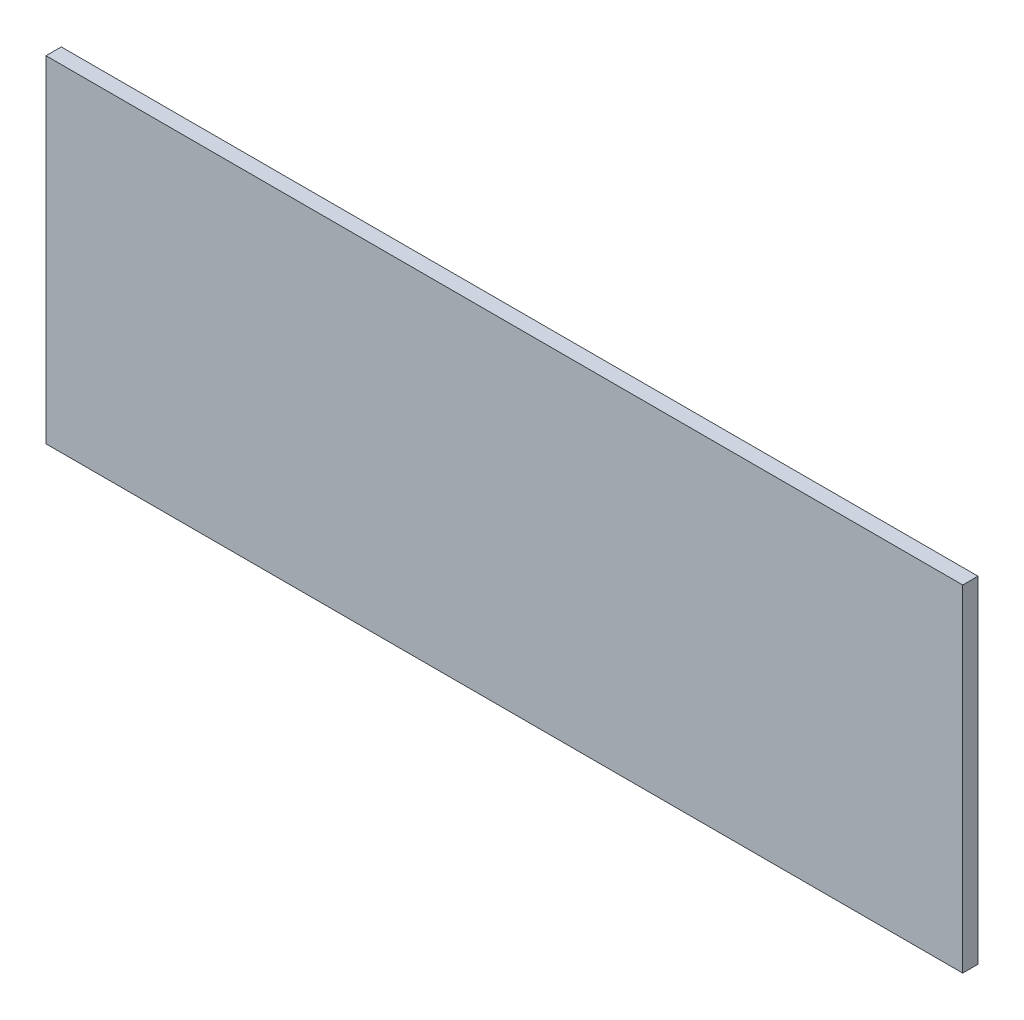
ISO-10303-21;
HEADER;
FILE_DESCRIPTION(('STEP AP214'),'2;1');
FILE_NAME('part.step','',(''),(''),'','','');
FILE_SCHEMA(('AUTOMOTIVE_DESIGN { 1 0 10303 214 1 1 1 1 }'));
ENDSEC;
DATA;
#1=APPLICATION_CONTEXT('core data for automotive mechanical design processes');
#2=APPLICATION_PROTOCOL_DEFINITION('international standard','automotive_design',2000,#1);
#3=PRODUCT_CONTEXT('',#1,'mechanical');
#4=PRODUCT('Part','Part','',(#3));
#5=PRODUCT_RELATED_PRODUCT_CATEGORY('part','',(#4));
#6=PRODUCT_DEFINITION_FORMATION('','',#4);
#7=PRODUCT_DEFINITION_CONTEXT('part definition',#1,'design');
#8=PRODUCT_DEFINITION('design','',#6,#7);
#9=PRODUCT_DEFINITION_SHAPE('','',#8);
#10=(LENGTH_UNIT() NAMED_UNIT(*) SI_UNIT(.MILLI.,.METRE.));
#11=(NAMED_UNIT(*) PLANE_ANGLE_UNIT() SI_UNIT($,.RADIAN.));
#12=(NAMED_UNIT(*) SI_UNIT($,.STERADIAN.) SOLID_ANGLE_UNIT());
#13=UNCERTAINTY_MEASURE_WITH_UNIT(LENGTH_MEASURE(1.E-05),#10,'distance_accuracy_value','');
#14=(GEOMETRIC_REPRESENTATION_CONTEXT(3) GLOBAL_UNCERTAINTY_ASSIGNED_CONTEXT((#13)) GLOBAL_UNIT_ASSIGNED_CONTEXT((#10,
#11,#12)) REPRESENTATION_CONTEXT('',''));
#15=CARTESIAN_POINT('',(0.,0.,0.));
#16=DIRECTION('',(0.,0.,1.));
#17=DIRECTION('',(1.,0.,0.));
#18=AXIS2_PLACEMENT_3D('',#15,#16,#17);
#19=CARTESIAN_POINT('',(90.,-33.,3.));
#20=DIRECTION('',(-1.,0.,0.));
#21=DIRECTION('',(0.,0.,1.));
#22=AXIS2_PLACEMENT_3D('',#19,#20,#21);
#23=PLANE('',#22);
#24=DIRECTION('',(0.,1.,0.));
#25=VECTOR('',#24,1.);
#26=CARTESIAN_POINT('',(90.,-33.,0.));
#27=LINE('',#26,#25);
#28=CARTESIAN_POINT('',(90.,-33.,0.));
#29=VERTEX_POINT('',#28);
#30=CARTESIAN_POINT('',(90.,33.,0.));
#31=VERTEX_POINT('',#30);
#32=EDGE_CURVE('E96',#29,#31,#27,.T.);
#33=ORIENTED_EDGE('',*,*,#32,.T.);
#34=DIRECTION('',(0.,0.,-1.));
#35=VECTOR('',#34,1.);
#36=CARTESIAN_POINT('',(90.,33.,3.));
#37=LINE('',#36,#35);
#38=CARTESIAN_POINT('',(90.,33.,3.));
#39=VERTEX_POINT('',#38);
#40=EDGE_CURVE('E11',#39,#31,#37,.T.);
#41=ORIENTED_EDGE('',*,*,#40,.F.);
#42=DIRECTION('',(0.,1.,0.));
#43=VECTOR('',#42,1.);
#44=CARTESIAN_POINT('',(90.,-33.,3.));
#45=LINE('',#44,#43);
#46=CARTESIAN_POINT('',(90.,-33.,3.));
#47=VERTEX_POINT('',#46);
#48=EDGE_CURVE('E84',#47,#39,#45,.T.);
#49=ORIENTED_EDGE('',*,*,#48,.F.);
#50=DIRECTION('',(0.,0.,-1.));
#51=VECTOR('',#50,1.);
#52=CARTESIAN_POINT('',(90.,-33.,3.));
#53=LINE('',#52,#51);
#54=EDGE_CURVE('E92',#47,#29,#53,.T.);
#55=ORIENTED_EDGE('',*,*,#54,.T.);
#56=EDGE_LOOP('',(#33,#41,#49,#55));
#57=FACE_BOUND('',#56,.T.);
#58=ADVANCED_FACE('F33',(#57),#23,.F.);
#59=CARTESIAN_POINT('',(-90.,33.,3.));
#60=DIRECTION('',(0.,-1.,0.));
#61=DIRECTION('',(0.,0.,-1.));
#62=AXIS2_PLACEMENT_3D('',#59,#60,#61);
#63=PLANE('',#62);
#64=DIRECTION('',(-1.,0.,0.));
#65=VECTOR('',#64,1.);
#66=CARTESIAN_POINT('',(-90.,33.,0.));
#67=LINE('',#66,#65);
#68=CARTESIAN_POINT('',(-90.,33.,0.));
#69=VERTEX_POINT('',#68);
#70=EDGE_CURVE('E88',#31,#69,#67,.T.);
#71=ORIENTED_EDGE('',*,*,#70,.T.);
#72=DIRECTION('',(0.,0.,-1.));
#73=VECTOR('',#72,1.);
#74=CARTESIAN_POINT('',(-90.,33.,3.));
#75=LINE('',#74,#73);
#76=CARTESIAN_POINT('',(-90.,33.,3.));
#77=VERTEX_POINT('',#76);
#78=EDGE_CURVE('E41',#77,#69,#75,.T.);
#79=ORIENTED_EDGE('',*,*,#78,.F.);
#80=DIRECTION('',(-1.,0.,0.));
#81=VECTOR('',#80,1.);
#82=CARTESIAN_POINT('',(-90.,33.,3.));
#83=LINE('',#82,#81);
#84=EDGE_CURVE('E79',#39,#77,#83,.T.);
#85=ORIENTED_EDGE('',*,*,#84,.F.);
#86=ORIENTED_EDGE('',*,*,#40,.T.);
#87=EDGE_LOOP('',(#71,#79,#85,#86));
#88=FACE_BOUND('',#87,.T.);
#89=ADVANCED_FACE('F87',(#88),#63,.F.);
#90=CARTESIAN_POINT('',(-90.,-33.,3.));
#91=DIRECTION('',(1.,0.,0.));
#92=DIRECTION('',(0.,0.,-1.));
#93=AXIS2_PLACEMENT_3D('',#90,#91,#92);
#94=PLANE('',#93);
#95=DIRECTION('',(0.,-1.,0.));
#96=VECTOR('',#95,1.);
#97=CARTESIAN_POINT('',(-90.,-33.,0.));
#98=LINE('',#97,#96);
#99=CARTESIAN_POINT('',(-90.,-33.,0.));
#100=VERTEX_POINT('',#99);
#101=EDGE_CURVE('E66',#69,#100,#98,.T.);
#102=ORIENTED_EDGE('',*,*,#101,.T.);
#103=DIRECTION('',(0.,0.,-1.));
#104=VECTOR('',#103,1.);
#105=CARTESIAN_POINT('',(-90.,-33.,3.));
#106=LINE('',#105,#104);
#107=CARTESIAN_POINT('',(-90.,-33.,3.));
#108=VERTEX_POINT('',#107);
#109=EDGE_CURVE('E89',#108,#100,#106,.T.);
#110=ORIENTED_EDGE('',*,*,#109,.F.);
#111=DIRECTION('',(0.,-1.,0.));
#112=VECTOR('',#111,1.);
#113=CARTESIAN_POINT('',(-90.,-33.,3.));
#114=LINE('',#113,#112);
#115=EDGE_CURVE('E82',#77,#108,#114,.T.);
#116=ORIENTED_EDGE('',*,*,#115,.F.);
#117=ORIENTED_EDGE('',*,*,#78,.T.);
#118=EDGE_LOOP('',(#102,#110,#116,#117));
#119=FACE_BOUND('',#118,.T.);
#120=ADVANCED_FACE('F90',(#119),#94,.F.);
#121=CARTESIAN_POINT('',(-90.,-33.,3.));
#122=DIRECTION('',(0.,1.,0.));
#123=DIRECTION('',(0.,0.,1.));
#124=AXIS2_PLACEMENT_3D('',#121,#122,#123);
#125=PLANE('',#124);
#126=DIRECTION('',(1.,0.,0.));
#127=VECTOR('',#126,1.);
#128=CARTESIAN_POINT('',(-90.,-33.,0.));
#129=LINE('',#128,#127);
#130=EDGE_CURVE('E72',#100,#29,#129,.T.);
#131=ORIENTED_EDGE('',*,*,#130,.T.);
#132=ORIENTED_EDGE('',*,*,#54,.F.);
#133=DIRECTION('',(1.,0.,0.));
#134=VECTOR('',#133,1.);
#135=CARTESIAN_POINT('',(-90.,-33.,3.));
#136=LINE('',#135,#134);
#137=EDGE_CURVE('E49',#108,#47,#136,.T.);
#138=ORIENTED_EDGE('',*,*,#137,.F.);
#139=ORIENTED_EDGE('',*,*,#109,.T.);
#140=EDGE_LOOP('',(#131,#132,#138,#139));
#141=FACE_BOUND('',#140,.T.);
#142=ADVANCED_FACE('F103',(#141),#125,.F.);
#143=CARTESIAN_POINT('',(0.,0.,3.));
#144=DIRECTION('',(0.,0.,-1.));
#145=DIRECTION('',(-1.,0.,0.));
#146=AXIS2_PLACEMENT_3D('',#143,#144,#145);
#147=PLANE('',#146);
#148=ORIENTED_EDGE('',*,*,#48,.T.);
#149=ORIENTED_EDGE('',*,*,#84,.T.);
#150=ORIENTED_EDGE('',*,*,#115,.T.);
#151=ORIENTED_EDGE('',*,*,#137,.T.);
#152=EDGE_LOOP('',(#148,#149,#150,#151));
#153=FACE_BOUND('',#152,.T.);
#154=ADVANCED_FACE('F80',(#153),#147,.F.);
#155=CARTESIAN_POINT('',(0.,0.,0.));
#156=DIRECTION('',(0.,0.,-1.));
#157=DIRECTION('',(-1.,0.,0.));
#158=AXIS2_PLACEMENT_3D('',#155,#156,#157);
#159=PLANE('',#158);
#160=ORIENTED_EDGE('',*,*,#32,.F.);
#161=ORIENTED_EDGE('',*,*,#130,.F.);
#162=ORIENTED_EDGE('',*,*,#101,.F.);
#163=ORIENTED_EDGE('',*,*,#70,.F.);
#164=EDGE_LOOP('',(#160,#161,#162,#163));
#165=FACE_BOUND('',#164,.T.);
#166=ADVANCED_FACE('F106',(#165),#159,.T.);
#167=CLOSED_SHELL('',(#58,#89,#120,#142,#154,#166));
#168=MANIFOLD_SOLID_BREP('B2',#167);
#169=ADVANCED_BREP_SHAPE_REPRESENTATION('',(#18,#168),#14);
#170=SHAPE_DEFINITION_REPRESENTATION(#9,#169);
ENDSEC;
END-ISO-10303-21;
